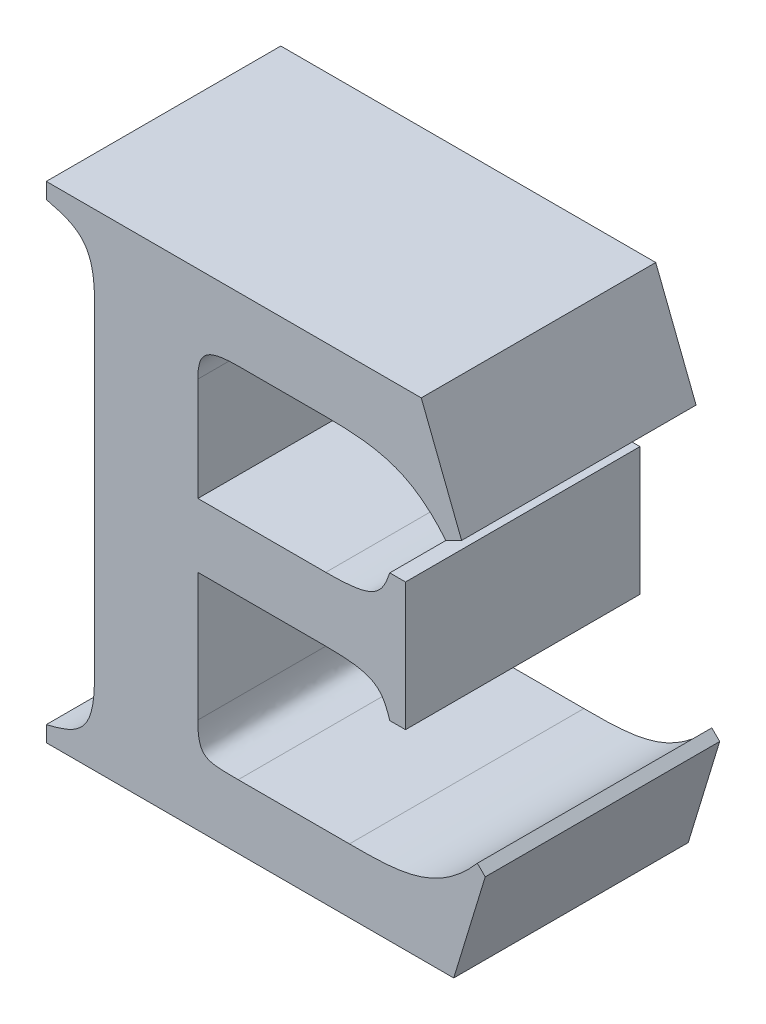
ISO-10303-21;
HEADER;
FILE_DESCRIPTION(('STEP AP214'),'2;1');
FILE_NAME('part.step','',(''),(''),'','','');
FILE_SCHEMA(('AUTOMOTIVE_DESIGN { 1 0 10303 214 1 1 1 1 }'));
ENDSEC;
DATA;
#1=APPLICATION_CONTEXT('core data for automotive mechanical design processes');
#2=APPLICATION_PROTOCOL_DEFINITION('international standard','automotive_design',2000,#1);
#3=PRODUCT_CONTEXT('',#1,'mechanical');
#4=PRODUCT('Part','Part','',(#3));
#5=PRODUCT_RELATED_PRODUCT_CATEGORY('part','',(#4));
#6=PRODUCT_DEFINITION_FORMATION('','',#4);
#7=PRODUCT_DEFINITION_CONTEXT('part definition',#1,'design');
#8=PRODUCT_DEFINITION('design','',#6,#7);
#9=PRODUCT_DEFINITION_SHAPE('','',#8);
#10=(LENGTH_UNIT() NAMED_UNIT(*) SI_UNIT(.MILLI.,.METRE.));
#11=(NAMED_UNIT(*) PLANE_ANGLE_UNIT() SI_UNIT($,.RADIAN.));
#12=(NAMED_UNIT(*) SI_UNIT($,.STERADIAN.) SOLID_ANGLE_UNIT());
#13=UNCERTAINTY_MEASURE_WITH_UNIT(LENGTH_MEASURE(1.E-05),#10,'distance_accuracy_value','');
#14=(GEOMETRIC_REPRESENTATION_CONTEXT(3) GLOBAL_UNCERTAINTY_ASSIGNED_CONTEXT((#13)) GLOBAL_UNIT_ASSIGNED_CONTEXT((#10,
#11,#12)) REPRESENTATION_CONTEXT('',''));
#15=CARTESIAN_POINT('',(0.,0.,0.));
#16=DIRECTION('',(0.,0.,1.));
#17=DIRECTION('',(1.,0.,0.));
#18=AXIS2_PLACEMENT_3D('',#15,#16,#17);
#19=CARTESIAN_POINT('',(0.951390842915,-0.14630890346375,0.));
#20=DIRECTION('',(0.,-1.,0.));
#21=DIRECTION('',(1.,0.,0.));
#22=AXIS2_PLACEMENT_3D('',#19,#20,#21);
#23=PLANE('',#22);
#24=DIRECTION('',(-1.,0.,0.));
#25=VECTOR('',#24,1.);
#26=CARTESIAN_POINT('',(1.125153850248,-0.14630890346375,0.));
#27=LINE('',#26,#25);
#28=CARTESIAN_POINT('',(1.125153850248,-0.14630890346375,0.));
#29=VERTEX_POINT('',#28);
#30=CARTESIAN_POINT('',(0.951390842915,-0.14630890346375,0.));
#31=VERTEX_POINT('',#30);
#32=EDGE_CURVE('E11',#29,#31,#27,.T.);
#33=ORIENTED_EDGE('',*,*,#32,.F.);
#34=DIRECTION('',(0.,0.,1.));
#35=VECTOR('',#34,1.);
#36=CARTESIAN_POINT('',(1.125153850248,-0.14630890346375,0.));
#37=LINE('',#36,#35);
#38=CARTESIAN_POINT('',(1.125153850248,-0.14630890346375,0.1));
#39=VERTEX_POINT('',#38);
#40=EDGE_CURVE('E24',#29,#39,#37,.T.);
#41=ORIENTED_EDGE('',*,*,#40,.T.);
#42=DIRECTION('',(1.,0.,0.));
#43=VECTOR('',#42,1.);
#44=CARTESIAN_POINT('',(1.125153850248,-0.14630890346375,0.1));
#45=LINE('',#44,#43);
#46=CARTESIAN_POINT('',(0.951390842915,-0.14630890346375,0.1));
#47=VERTEX_POINT('',#46);
#48=EDGE_CURVE('E208',#47,#39,#45,.T.);
#49=ORIENTED_EDGE('',*,*,#48,.F.);
#50=DIRECTION('',(0.,0.,1.));
#51=VECTOR('',#50,1.);
#52=CARTESIAN_POINT('',(0.951390842915,-0.14630890346375,0.));
#53=LINE('',#52,#51);
#54=EDGE_CURVE('E473',#31,#47,#53,.T.);
#55=ORIENTED_EDGE('',*,*,#54,.F.);
#56=EDGE_LOOP('',(#33,#41,#49,#55));
#57=FACE_BOUND('',#56,.T.);
#58=ADVANCED_FACE('F17',(#57),#23,.T.);
#59=CARTESIAN_POINT('',(0.951390842915,-0.13959341000028,0.));
#60=DIRECTION('',(-1.,0.,0.));
#61=DIRECTION('',(0.,-1.,0.));
#62=AXIS2_PLACEMENT_3D('',#59,#60,#61);
#63=PLANE('',#62);
#64=DIRECTION('',(0.,1.,0.));
#65=VECTOR('',#64,1.);
#66=CARTESIAN_POINT('',(0.951390842915,-0.14630890346375,0.));
#67=LINE('',#66,#65);
#68=CARTESIAN_POINT('',(0.951390842915,-0.13959341000028,0.));
#69=VERTEX_POINT('',#68);
#70=EDGE_CURVE('E471',#31,#69,#67,.T.);
#71=ORIENTED_EDGE('',*,*,#70,.F.);
#72=ORIENTED_EDGE('',*,*,#54,.T.);
#73=DIRECTION('',(0.,-1.,0.));
#74=VECTOR('',#73,1.);
#75=CARTESIAN_POINT('',(0.951390842915,-0.14630890346375,0.1));
#76=LINE('',#75,#74);
#77=CARTESIAN_POINT('',(0.951390842915,-0.13959341000028,0.1));
#78=VERTEX_POINT('',#77);
#79=EDGE_CURVE('E469',#78,#47,#76,.T.);
#80=ORIENTED_EDGE('',*,*,#79,.F.);
#81=DIRECTION('',(0.,0.,1.));
#82=VECTOR('',#81,1.);
#83=CARTESIAN_POINT('',(0.951390842915,-0.13959341000028,0.));
#84=LINE('',#83,#82);
#85=EDGE_CURVE('E463',#69,#78,#84,.T.);
#86=ORIENTED_EDGE('',*,*,#85,.F.);
#87=EDGE_LOOP('',(#71,#72,#80,#86));
#88=FACE_BOUND('',#87,.T.);
#89=ADVANCED_FACE('F567',(#88),#63,.T.);
#90=CARTESIAN_POINT('',(0.971956860328,-0.11231186792928,0.));
#91=CARTESIAN_POINT('',(0.971956860328,-0.11231186792928,0.1));
#92=CARTESIAN_POINT('',(0.971956860328,-0.13287791653682,0.));
#93=CARTESIAN_POINT('',(0.971956860328,-0.13287791653682,0.1));
#94=CARTESIAN_POINT('',(0.965241585227,-0.13623558528189,0.));
#95=CARTESIAN_POINT('',(0.965241585227,-0.13623558528189,0.1));
#96=CARTESIAN_POINT('',(0.951390842915,-0.13959341000028,0.));
#97=CARTESIAN_POINT('',(0.951390842915,-0.13959341000028,0.1));
#98=B_SPLINE_SURFACE_WITH_KNOTS('',3,1,((#90,#91),(#92,#93),(#94,#95),(#96,#97)),.UNSPECIFIED.,
.F.,.F.,.F.,(4,4),(2,2),(-1.,0.),(0.,0.01),.UNSPECIFIED.);
#99=CARTESIAN_POINT('',(0.951390842915,-0.13959341000028,0.));
#100=CARTESIAN_POINT('',(0.965241585227,-0.13623558528189,0.));
#101=CARTESIAN_POINT('',(0.971956860328,-0.13287791653682,0.));
#102=CARTESIAN_POINT('',(0.971956860328,-0.11231186792928,0.));
#103=B_SPLINE_CURVE_WITH_KNOTS('',3,(#99,#100,#101,#102),.UNSPECIFIED.,.F.,.F.,(4,4),(0.,1.),.UNSPECIFIED.);
#104=CARTESIAN_POINT('',(0.971956860328,-0.11231186792928,0.));
#105=VERTEX_POINT('',#104);
#106=EDGE_CURVE('E456',#69,#105,#103,.T.);
#107=CARTESIAN_POINT('',(0.971956860328,-0.11231186792928,0.1));
#108=CARTESIAN_POINT('',(0.971956860328,-0.13287791653682,0.1));
#109=CARTESIAN_POINT('',(0.965241585227,-0.13623558528189,0.1));
#110=CARTESIAN_POINT('',(0.951390842915,-0.13959341000028,0.1));
#111=B_SPLINE_CURVE_WITH_KNOTS('',3,(#107,#108,#109,#110),.UNSPECIFIED.,.F.,.F.,(4,4),(-1.,0.),.UNSPECIFIED.);
#112=CARTESIAN_POINT('',(0.971956860328,-0.11231186792928,0.1));
#113=VERTEX_POINT('',#112);
#114=EDGE_CURVE('E451',#113,#78,#111,.T.);
#115=DIRECTION('',(0.,0.,1.));
#116=VECTOR('',#115,1.);
#117=CARTESIAN_POINT('',(0.971956860328,-0.11231186792928,0.));
#118=LINE('',#117,#116);
#119=EDGE_CURVE('E448',#105,#113,#118,.T.);
#120=ORIENTED_EDGE('',*,*,#106,.F.);
#121=ORIENTED_EDGE('',*,*,#85,.T.);
#122=ORIENTED_EDGE('',*,*,#114,.F.);
#123=ORIENTED_EDGE('',*,*,#119,.F.);
#124=EDGE_LOOP('',(#120,#121,#122,#123));
#125=FACE_BOUND('',#124,.T.);
#126=ADVANCED_FACE('F563',(#125),#98,.T.);
#127=CARTESIAN_POINT('',(0.971956860328,0.027034067732,0.));
#128=DIRECTION('',(-1.,0.,0.));
#129=DIRECTION('',(0.,-1.,0.));
#130=AXIS2_PLACEMENT_3D('',#127,#128,#129);
#131=PLANE('',#130);
#132=DIRECTION('',(0.,1.,0.));
#133=VECTOR('',#132,1.);
#134=CARTESIAN_POINT('',(0.971956860328,-0.11231186792928,0.));
#135=LINE('',#134,#133);
#136=CARTESIAN_POINT('',(0.971956860328,0.027034067732,0.));
#137=VERTEX_POINT('',#136);
#138=EDGE_CURVE('E446',#105,#137,#135,.T.);
#139=ORIENTED_EDGE('',*,*,#138,.F.);
#140=ORIENTED_EDGE('',*,*,#119,.T.);
#141=DIRECTION('',(0.,-1.,0.));
#142=VECTOR('',#141,1.);
#143=CARTESIAN_POINT('',(0.971956860328,-0.11231186792928,0.1));
#144=LINE('',#143,#142);
#145=CARTESIAN_POINT('',(0.971956860328,0.027034067732,0.1));
#146=VERTEX_POINT('',#145);
#147=EDGE_CURVE('E443',#146,#113,#144,.T.);
#148=ORIENTED_EDGE('',*,*,#147,.F.);
#149=DIRECTION('',(0.,0.,1.));
#150=VECTOR('',#149,1.);
#151=CARTESIAN_POINT('',(0.971956860328,0.027034067732,0.));
#152=LINE('',#151,#150);
#153=EDGE_CURVE('E437',#137,#146,#152,.T.);
#154=ORIENTED_EDGE('',*,*,#153,.F.);
#155=EDGE_LOOP('',(#139,#140,#148,#154));
#156=FACE_BOUND('',#155,.T.);
#157=ADVANCED_FACE('F559',(#156),#131,.T.);
#158=CARTESIAN_POINT('',(0.951390842915,0.054315609803,0.));
#159=CARTESIAN_POINT('',(0.951390842915,0.054315609803,0.1));
#160=CARTESIAN_POINT('',(0.965241585227,0.050957941058,0.));
#161=CARTESIAN_POINT('',(0.965241585227,0.050957941058,0.1));
#162=CARTESIAN_POINT('',(0.971956860328,0.047600147535,0.));
#163=CARTESIAN_POINT('',(0.971956860328,0.047600147535,0.1));
#164=CARTESIAN_POINT('',(0.971956860328,0.027034067732,0.));
#165=CARTESIAN_POINT('',(0.971956860328,0.027034067732,0.1));
#166=B_SPLINE_SURFACE_WITH_KNOTS('',3,1,((#158,#159),(#160,#161),(#162,#163),(#164,#165)),
.UNSPECIFIED.,.F.,.F.,.F.,(4,4),(2,2),(-1.,0.),(0.,0.01),.UNSPECIFIED.);
#167=CARTESIAN_POINT('',(0.971956860328,0.027034067732,0.));
#168=CARTESIAN_POINT('',(0.971956860328,0.047600147535,0.));
#169=CARTESIAN_POINT('',(0.965241585227,0.050957941058,0.));
#170=CARTESIAN_POINT('',(0.951390842915,0.054315609803,0.));
#171=B_SPLINE_CURVE_WITH_KNOTS('',3,(#167,#168,#169,#170),.UNSPECIFIED.,.F.,.F.,(4,4),(0.,1.),.UNSPECIFIED.);
#172=CARTESIAN_POINT('',(0.951390842915,0.054315609803,0.));
#173=VERTEX_POINT('',#172);
#174=EDGE_CURVE('E430',#137,#173,#171,.T.);
#175=CARTESIAN_POINT('',(0.951390842915,0.054315609803,0.1));
#176=CARTESIAN_POINT('',(0.965241585227,0.050957941058,0.1));
#177=CARTESIAN_POINT('',(0.971956860328,0.047600147535,0.1));
#178=CARTESIAN_POINT('',(0.971956860328,0.027034067732,0.1));
#179=B_SPLINE_CURVE_WITH_KNOTS('',3,(#175,#176,#177,#178),.UNSPECIFIED.,.F.,.F.,(4,4),(-1.,0.),.UNSPECIFIED.);
#180=CARTESIAN_POINT('',(0.951390842915,0.054315609803,0.1));
#181=VERTEX_POINT('',#180);
#182=EDGE_CURVE('E425',#181,#146,#179,.T.);
#183=DIRECTION('',(0.,0.,1.));
#184=VECTOR('',#183,1.);
#185=CARTESIAN_POINT('',(0.951390842915,0.054315609803,0.));
#186=LINE('',#185,#184);
#187=EDGE_CURVE('E422',#173,#181,#186,.T.);
#188=ORIENTED_EDGE('',*,*,#174,.F.);
#189=ORIENTED_EDGE('',*,*,#153,.T.);
#190=ORIENTED_EDGE('',*,*,#182,.F.);
#191=ORIENTED_EDGE('',*,*,#187,.F.);
#192=EDGE_LOOP('',(#188,#189,#190,#191));
#193=FACE_BOUND('',#192,.T.);
#194=ADVANCED_FACE('F555',(#193),#166,.T.);
#195=CARTESIAN_POINT('',(0.951390842915,0.061031103267,0.));
#196=DIRECTION('',(-1.,0.,0.));
#197=DIRECTION('',(0.,-1.,0.));
#198=AXIS2_PLACEMENT_3D('',#195,#196,#197);
#199=PLANE('',#198);
#200=DIRECTION('',(0.,1.,0.));
#201=VECTOR('',#200,1.);
#202=CARTESIAN_POINT('',(0.951390842915,0.054315609803,0.));
#203=LINE('',#202,#201);
#204=CARTESIAN_POINT('',(0.951390842915,0.061031103267,0.));
#205=VERTEX_POINT('',#204);
#206=EDGE_CURVE('E420',#173,#205,#203,.T.);
#207=ORIENTED_EDGE('',*,*,#206,.F.);
#208=ORIENTED_EDGE('',*,*,#187,.T.);
#209=DIRECTION('',(0.,-1.,0.));
#210=VECTOR('',#209,1.);
#211=CARTESIAN_POINT('',(0.951390842915,0.054315609803,0.1));
#212=LINE('',#211,#210);
#213=CARTESIAN_POINT('',(0.951390842915,0.061031103267,0.1));
#214=VERTEX_POINT('',#213);
#215=EDGE_CURVE('E417',#214,#181,#212,.T.);
#216=ORIENTED_EDGE('',*,*,#215,.F.);
#217=DIRECTION('',(0.,0.,1.));
#218=VECTOR('',#217,1.);
#219=CARTESIAN_POINT('',(0.951390842915,0.061031103267,0.));
#220=LINE('',#219,#218);
#221=EDGE_CURVE('E414',#205,#214,#220,.T.);
#222=ORIENTED_EDGE('',*,*,#221,.F.);
#223=EDGE_LOOP('',(#207,#208,#216,#222));
#224=FACE_BOUND('',#223,.T.);
#225=ADVANCED_FACE('F551',(#224),#199,.T.);
#226=CARTESIAN_POINT('',(1.111302795989,0.061031103267,0.));
#227=DIRECTION('',(0.,1.,0.));
#228=DIRECTION('',(-1.,0.,0.));
#229=AXIS2_PLACEMENT_3D('',#226,#227,#228);
#230=PLANE('',#229);
#231=DIRECTION('',(1.,0.,0.));
#232=VECTOR('',#231,1.);
#233=CARTESIAN_POINT('',(0.951390842915,0.061031103267,0.));
#234=LINE('',#233,#232);
#235=CARTESIAN_POINT('',(1.111302795989,0.061031103267,0.));
#236=VERTEX_POINT('',#235);
#237=EDGE_CURVE('E412',#205,#236,#234,.T.);
#238=ORIENTED_EDGE('',*,*,#237,.F.);
#239=ORIENTED_EDGE('',*,*,#221,.T.);
#240=DIRECTION('',(-1.,0.,0.));
#241=VECTOR('',#240,1.);
#242=CARTESIAN_POINT('',(0.951390842915,0.061031103267,0.1));
#243=LINE('',#242,#241);
#244=CARTESIAN_POINT('',(1.111302795989,0.061031103267,0.1));
#245=VERTEX_POINT('',#244);
#246=EDGE_CURVE('E409',#245,#214,#243,.T.);
#247=ORIENTED_EDGE('',*,*,#246,.F.);
#248=DIRECTION('',(0.,0.,1.));
#249=VECTOR('',#248,1.);
#250=CARTESIAN_POINT('',(1.111302795989,0.061031103267,0.));
#251=LINE('',#250,#249);
#252=EDGE_CURVE('E406',#236,#245,#251,.T.);
#253=ORIENTED_EDGE('',*,*,#252,.F.);
#254=EDGE_LOOP('',(#238,#239,#247,#253));
#255=FACE_BOUND('',#254,.T.);
#256=ADVANCED_FACE('F547',(#255),#230,.T.);
#257=CARTESIAN_POINT('',(1.128510707932,0.016960905524,0.));
#258=DIRECTION('',(0.931507550185622,0.363721987164896,0.));
#259=DIRECTION('',(-0.363721987164896,0.931507550185622,0.));
#260=AXIS2_PLACEMENT_3D('',#257,#258,#259);
#261=PLANE('',#260);
#262=DIRECTION('',(0.363721987164896,-0.931507550185622,0.));
#263=VECTOR('',#262,1.);
#264=CARTESIAN_POINT('',(1.111302795989,0.061031103267,0.));
#265=LINE('',#264,#263);
#266=CARTESIAN_POINT('',(1.128510707932,0.016960905524,0.));
#267=VERTEX_POINT('',#266);
#268=EDGE_CURVE('E404',#236,#267,#265,.T.);
#269=ORIENTED_EDGE('',*,*,#268,.F.);
#270=ORIENTED_EDGE('',*,*,#252,.T.);
#271=DIRECTION('',(-0.363721987164896,0.931507550185622,0.));
#272=VECTOR('',#271,1.);
#273=CARTESIAN_POINT('',(1.111302795989,0.061031103267,0.1));
#274=LINE('',#273,#272);
#275=CARTESIAN_POINT('',(1.128510707932,0.016960905524,0.1));
#276=VERTEX_POINT('',#275);
#277=EDGE_CURVE('E401',#276,#245,#274,.T.);
#278=ORIENTED_EDGE('',*,*,#277,.F.);
#279=DIRECTION('',(0.,0.,1.));
#280=VECTOR('',#279,1.);
#281=CARTESIAN_POINT('',(1.128510707932,0.016960905524,0.));
#282=LINE('',#281,#280);
#283=EDGE_CURVE('E398',#267,#276,#282,.T.);
#284=ORIENTED_EDGE('',*,*,#283,.F.);
#285=EDGE_LOOP('',(#269,#270,#278,#284));
#286=FACE_BOUND('',#285,.T.);
#287=ADVANCED_FACE('F543',(#286),#261,.T.);
#288=CARTESIAN_POINT('',(1.121795432831,0.013603112,0.));
#289=DIRECTION('',(0.447230214922771,-0.894418881095503,0.));
#290=DIRECTION('',(0.894418881095503,0.447230214922771,0.));
#291=AXIS2_PLACEMENT_3D('',#288,#289,#290);
#292=PLANE('',#291);
#293=DIRECTION('',(-0.894418881095503,-0.447230214922771,0.));
#294=VECTOR('',#293,1.);
#295=CARTESIAN_POINT('',(1.128510707932,0.016960905524,0.));
#296=LINE('',#295,#294);
#297=CARTESIAN_POINT('',(1.121795432831,0.013603112,0.));
#298=VERTEX_POINT('',#297);
#299=EDGE_CURVE('E396',#267,#298,#296,.T.);
#300=ORIENTED_EDGE('',*,*,#299,.F.);
#301=ORIENTED_EDGE('',*,*,#283,.T.);
#302=DIRECTION('',(0.894418881095503,0.447230214922771,0.));
#303=VECTOR('',#302,1.);
#304=CARTESIAN_POINT('',(1.128510707932,0.016960905524,0.1));
#305=LINE('',#304,#303);
#306=CARTESIAN_POINT('',(1.121795432831,0.013603112,0.1));
#307=VERTEX_POINT('',#306);
#308=EDGE_CURVE('E393',#307,#276,#305,.T.);
#309=ORIENTED_EDGE('',*,*,#308,.F.);
#310=DIRECTION('',(0.,0.,1.));
#311=VECTOR('',#310,1.);
#312=CARTESIAN_POINT('',(1.121795432831,0.013603112,0.));
#313=LINE('',#312,#311);
#314=EDGE_CURVE('E387',#298,#307,#313,.T.);
#315=ORIENTED_EDGE('',*,*,#314,.F.);
#316=EDGE_LOOP('',(#300,#301,#309,#315));
#317=FACE_BOUND('',#316,.T.);
#318=ADVANCED_FACE('F539',(#317),#292,.T.);
#319=CARTESIAN_POINT('',(1.070590641327,0.033749561196,0.));
#320=CARTESIAN_POINT('',(1.070590641327,0.033749561196,0.1));
#321=CARTESIAN_POINT('',(1.094513828371,0.033749561196,0.));
#322=CARTESIAN_POINT('',(1.094513828371,0.033749561196,0.1));
#323=CARTESIAN_POINT('',(1.107944690519,0.0303917676719999,0.));
#324=CARTESIAN_POINT('',(1.107944690519,0.0303917676719999,0.1));
#325=CARTESIAN_POINT('',(1.121795432831,0.013603112,0.));
#326=CARTESIAN_POINT('',(1.121795432831,0.013603112,0.1));
#327=B_SPLINE_SURFACE_WITH_KNOTS('',3,1,((#319,#320),(#321,#322),(#323,#324),(#325,#326)),
.UNSPECIFIED.,.F.,.F.,.F.,(4,4),(2,2),(-1.,0.),(0.,0.01),.UNSPECIFIED.);
#328=CARTESIAN_POINT('',(1.121795432831,0.013603112,0.));
#329=CARTESIAN_POINT('',(1.107944690519,0.0303917676719999,0.));
#330=CARTESIAN_POINT('',(1.094513828371,0.033749561196,0.));
#331=CARTESIAN_POINT('',(1.070590641327,0.033749561196,0.));
#332=B_SPLINE_CURVE_WITH_KNOTS('',3,(#328,#329,#330,#331),.UNSPECIFIED.,.F.,.F.,(4,4),(0.,1.),.UNSPECIFIED.);
#333=CARTESIAN_POINT('',(1.070590641327,0.033749561196,0.));
#334=VERTEX_POINT('',#333);
#335=EDGE_CURVE('E380',#298,#334,#332,.T.);
#336=CARTESIAN_POINT('',(1.070590641327,0.033749561196,0.1));
#337=CARTESIAN_POINT('',(1.094513828371,0.033749561196,0.1));
#338=CARTESIAN_POINT('',(1.107944690519,0.0303917676719999,0.1));
#339=CARTESIAN_POINT('',(1.121795432831,0.013603112,0.1));
#340=B_SPLINE_CURVE_WITH_KNOTS('',3,(#336,#337,#338,#339),.UNSPECIFIED.,.F.,.F.,(4,4),(-1.,0.),.UNSPECIFIED.);
#341=CARTESIAN_POINT('',(1.070590641327,0.033749561196,0.1));
#342=VERTEX_POINT('',#341);
#343=EDGE_CURVE('E375',#342,#307,#340,.T.);
#344=DIRECTION('',(0.,0.,1.));
#345=VECTOR('',#344,1.);
#346=CARTESIAN_POINT('',(1.070590641327,0.033749561196,0.));
#347=LINE('',#346,#345);
#348=EDGE_CURVE('E372',#334,#342,#347,.T.);
#349=ORIENTED_EDGE('',*,*,#335,.F.);
#350=ORIENTED_EDGE('',*,*,#314,.T.);
#351=ORIENTED_EDGE('',*,*,#343,.F.);
#352=ORIENTED_EDGE('',*,*,#348,.F.);
#353=EDGE_LOOP('',(#349,#350,#351,#352));
#354=FACE_BOUND('',#353,.T.);
#355=ADVANCED_FACE('F535',(#354),#327,.T.);
#356=CARTESIAN_POINT('',(1.033235344349,0.033749561196,0.));
#357=DIRECTION('',(0.,-1.,0.));
#358=DIRECTION('',(1.,0.,0.));
#359=AXIS2_PLACEMENT_3D('',#356,#357,#358);
#360=PLANE('',#359);
#361=DIRECTION('',(-1.,0.,0.));
#362=VECTOR('',#361,1.);
#363=CARTESIAN_POINT('',(1.070590641327,0.033749561196,0.));
#364=LINE('',#363,#362);
#365=CARTESIAN_POINT('',(1.033235344349,0.033749561196,0.));
#366=VERTEX_POINT('',#365);
#367=EDGE_CURVE('E370',#334,#366,#364,.T.);
#368=ORIENTED_EDGE('',*,*,#367,.F.);
#369=ORIENTED_EDGE('',*,*,#348,.T.);
#370=DIRECTION('',(1.,0.,0.));
#371=VECTOR('',#370,1.);
#372=CARTESIAN_POINT('',(1.070590641327,0.033749561196,0.1));
#373=LINE('',#372,#371);
#374=CARTESIAN_POINT('',(1.033235344349,0.033749561196,0.1));
#375=VERTEX_POINT('',#374);
#376=EDGE_CURVE('E367',#375,#342,#373,.T.);
#377=ORIENTED_EDGE('',*,*,#376,.F.);
#378=DIRECTION('',(0.,0.,1.));
#379=VECTOR('',#378,1.);
#380=CARTESIAN_POINT('',(1.033235344349,0.033749561196,0.));
#381=LINE('',#380,#379);
#382=EDGE_CURVE('E361',#366,#375,#381,.T.);
#383=ORIENTED_EDGE('',*,*,#382,.F.);
#384=EDGE_LOOP('',(#368,#369,#377,#383));
#385=FACE_BOUND('',#384,.T.);
#386=ADVANCED_FACE('F531',(#385),#360,.T.);
#387=CARTESIAN_POINT('',(1.016027432407,0.020318574269,0.));
#388=CARTESIAN_POINT('',(1.016027432407,0.020318574269,0.1));
#389=CARTESIAN_POINT('',(1.016027432407,0.030391767672,0.));
#390=CARTESIAN_POINT('',(1.016027432407,0.030391767672,0.1));
#391=CARTESIAN_POINT('',(1.019384602037,0.033749561196,0.));
#392=CARTESIAN_POINT('',(1.019384602037,0.033749561196,0.1));
#393=CARTESIAN_POINT('',(1.033235344349,0.033749561196,0.));
#394=CARTESIAN_POINT('',(1.033235344349,0.033749561196,0.1));
#395=B_SPLINE_SURFACE_WITH_KNOTS('',3,1,((#387,#388),(#389,#390),(#391,#392),(#393,#394)),
.UNSPECIFIED.,.F.,.F.,.F.,(4,4),(2,2),(-1.,0.),(0.,0.01),.UNSPECIFIED.);
#396=CARTESIAN_POINT('',(1.033235344349,0.033749561196,0.));
#397=CARTESIAN_POINT('',(1.019384602037,0.033749561196,0.));
#398=CARTESIAN_POINT('',(1.016027432407,0.030391767672,0.));
#399=CARTESIAN_POINT('',(1.016027432407,0.020318574269,0.));
#400=B_SPLINE_CURVE_WITH_KNOTS('',3,(#396,#397,#398,#399),.UNSPECIFIED.,.F.,.F.,(4,4),(0.,1.),.UNSPECIFIED.);
#401=CARTESIAN_POINT('',(1.016027432407,0.020318574269,0.));
#402=VERTEX_POINT('',#401);
#403=EDGE_CURVE('E354',#366,#402,#400,.T.);
#404=CARTESIAN_POINT('',(1.016027432407,0.020318574269,0.1));
#405=CARTESIAN_POINT('',(1.016027432407,0.030391767672,0.1));
#406=CARTESIAN_POINT('',(1.019384602037,0.033749561196,0.1));
#407=CARTESIAN_POINT('',(1.033235344349,0.033749561196,0.1));
#408=B_SPLINE_CURVE_WITH_KNOTS('',3,(#404,#405,#406,#407),.UNSPECIFIED.,.F.,.F.,(4,4),(-1.,0.),.UNSPECIFIED.);
#409=CARTESIAN_POINT('',(1.016027432407,0.020318574269,0.1));
#410=VERTEX_POINT('',#409);
#411=EDGE_CURVE('E349',#410,#375,#408,.T.);
#412=DIRECTION('',(0.,0.,1.));
#413=VECTOR('',#412,1.);
#414=CARTESIAN_POINT('',(1.016027432407,0.020318574269,0.));
#415=LINE('',#414,#413);
#416=EDGE_CURVE('E346',#402,#410,#415,.T.);
#417=ORIENTED_EDGE('',*,*,#403,.F.);
#418=ORIENTED_EDGE('',*,*,#382,.T.);
#419=ORIENTED_EDGE('',*,*,#411,.F.);
#420=ORIENTED_EDGE('',*,*,#416,.F.);
#421=EDGE_LOOP('',(#417,#418,#419,#420));
#422=FACE_BOUND('',#421,.T.);
#423=ADVANCED_FACE('F527',(#422),#395,.T.);
#424=CARTESIAN_POINT('',(1.016027432407,-0.023751623474,0.));
#425=DIRECTION('',(1.,0.,0.));
#426=DIRECTION('',(0.,1.,0.));
#427=AXIS2_PLACEMENT_3D('',#424,#425,#426);
#428=PLANE('',#427);
#429=DIRECTION('',(0.,-1.,0.));
#430=VECTOR('',#429,1.);
#431=CARTESIAN_POINT('',(1.016027432407,0.020318574269,0.));
#432=LINE('',#431,#430);
#433=CARTESIAN_POINT('',(1.016027432407,-0.023751623474,0.));
#434=VERTEX_POINT('',#433);
#435=EDGE_CURVE('E344',#402,#434,#432,.T.);
#436=ORIENTED_EDGE('',*,*,#435,.F.);
#437=ORIENTED_EDGE('',*,*,#416,.T.);
#438=DIRECTION('',(0.,1.,0.));
#439=VECTOR('',#438,1.);
#440=CARTESIAN_POINT('',(1.016027432407,0.020318574269,0.1));
#441=LINE('',#440,#439);
#442=CARTESIAN_POINT('',(1.016027432407,-0.023751623474,0.1));
#443=VERTEX_POINT('',#442);
#444=EDGE_CURVE('E341',#443,#410,#441,.T.);
#445=ORIENTED_EDGE('',*,*,#444,.F.);
#446=DIRECTION('',(0.,0.,1.));
#447=VECTOR('',#446,1.);
#448=CARTESIAN_POINT('',(1.016027432407,-0.023751623474,0.));
#449=LINE('',#448,#447);
#450=EDGE_CURVE('E338',#434,#443,#449,.T.);
#451=ORIENTED_EDGE('',*,*,#450,.F.);
#452=EDGE_LOOP('',(#436,#437,#445,#451));
#453=FACE_BOUND('',#452,.T.);
#454=ADVANCED_FACE('F523',(#453),#428,.T.);
#455=CARTESIAN_POINT('',(1.070590641327,-0.023751623474,0.));
#456=DIRECTION('',(0.,1.,0.));
#457=DIRECTION('',(-1.,0.,0.));
#458=AXIS2_PLACEMENT_3D('',#455,#456,#457);
#459=PLANE('',#458);
#460=DIRECTION('',(1.,0.,0.));
#461=VECTOR('',#460,1.);
#462=CARTESIAN_POINT('',(1.016027432407,-0.023751623474,0.));
#463=LINE('',#462,#461);
#464=CARTESIAN_POINT('',(1.070590641327,-0.023751623474,0.));
#465=VERTEX_POINT('',#464);
#466=EDGE_CURVE('E336',#434,#465,#463,.T.);
#467=ORIENTED_EDGE('',*,*,#466,.F.);
#468=ORIENTED_EDGE('',*,*,#450,.T.);
#469=DIRECTION('',(-1.,0.,0.));
#470=VECTOR('',#469,1.);
#471=CARTESIAN_POINT('',(1.016027432407,-0.023751623474,0.1));
#472=LINE('',#471,#470);
#473=CARTESIAN_POINT('',(1.070590641327,-0.023751623474,0.1));
#474=VERTEX_POINT('',#473);
#475=EDGE_CURVE('E333',#474,#443,#472,.T.);
#476=ORIENTED_EDGE('',*,*,#475,.F.);
#477=DIRECTION('',(0.,0.,1.));
#478=VECTOR('',#477,1.);
#479=CARTESIAN_POINT('',(1.070590641327,-0.023751623474,0.));
#480=LINE('',#479,#478);
#481=EDGE_CURVE('E327',#465,#474,#480,.T.);
#482=ORIENTED_EDGE('',*,*,#481,.F.);
#483=EDGE_LOOP('',(#467,#468,#476,#482));
#484=FACE_BOUND('',#483,.T.);
#485=ADVANCED_FACE('F519',(#484),#459,.T.);
#486=CARTESIAN_POINT('',(1.097872245788,-0.010320636547,0.));
#487=CARTESIAN_POINT('',(1.097872245788,-0.010320636547,0.1));
#488=CARTESIAN_POINT('',(1.094513828371,-0.0203939235340003,0.));
#489=CARTESIAN_POINT('',(1.094513828371,-0.0203939235340003,0.1));
#490=CARTESIAN_POINT('',(1.091156970687,-0.0237516234740003,0.));
#491=CARTESIAN_POINT('',(1.091156970687,-0.0237516234740003,0.1));
#492=CARTESIAN_POINT('',(1.070590641327,-0.023751623474,0.));
#493=CARTESIAN_POINT('',(1.070590641327,-0.023751623474,0.1));
#494=B_SPLINE_SURFACE_WITH_KNOTS('',3,1,((#486,#487),(#488,#489),(#490,#491),(#492,#493)),
.UNSPECIFIED.,.F.,.F.,.F.,(4,4),(2,2),(-1.,0.),(0.,0.01),.UNSPECIFIED.);
#495=CARTESIAN_POINT('',(1.070590641327,-0.023751623474,0.));
#496=CARTESIAN_POINT('',(1.091156970687,-0.0237516234740003,0.));
#497=CARTESIAN_POINT('',(1.094513828371,-0.0203939235340003,0.));
#498=CARTESIAN_POINT('',(1.097872245788,-0.010320636547,0.));
#499=B_SPLINE_CURVE_WITH_KNOTS('',3,(#495,#496,#497,#498),.UNSPECIFIED.,.F.,.F.,(4,4),(0.,1.),.UNSPECIFIED.);
#500=CARTESIAN_POINT('',(1.097872245788,-0.010320636547,0.));
#501=VERTEX_POINT('',#500);
#502=EDGE_CURVE('E320',#465,#501,#499,.T.);
#503=CARTESIAN_POINT('',(1.097872245788,-0.010320636547,0.1));
#504=CARTESIAN_POINT('',(1.094513828371,-0.0203939235340003,0.1));
#505=CARTESIAN_POINT('',(1.091156970687,-0.0237516234740003,0.1));
#506=CARTESIAN_POINT('',(1.070590641327,-0.023751623474,0.1));
#507=B_SPLINE_CURVE_WITH_KNOTS('',3,(#503,#504,#505,#506),.UNSPECIFIED.,.F.,.F.,(4,4),(-1.,0.),.UNSPECIFIED.);
#508=CARTESIAN_POINT('',(1.097872245788,-0.010320636547,0.1));
#509=VERTEX_POINT('',#508);
#510=EDGE_CURVE('E315',#509,#474,#507,.T.);
#511=DIRECTION('',(0.,0.,1.));
#512=VECTOR('',#511,1.);
#513=CARTESIAN_POINT('',(1.097872245788,-0.010320636547,0.));
#514=LINE('',#513,#512);
#515=EDGE_CURVE('E312',#501,#509,#514,.T.);
#516=ORIENTED_EDGE('',*,*,#502,.F.);
#517=ORIENTED_EDGE('',*,*,#481,.T.);
#518=ORIENTED_EDGE('',*,*,#510,.F.);
#519=ORIENTED_EDGE('',*,*,#515,.F.);
#520=EDGE_LOOP('',(#516,#517,#518,#519));
#521=FACE_BOUND('',#520,.T.);
#522=ADVANCED_FACE('F515',(#521),#494,.T.);
#523=CARTESIAN_POINT('',(1.104587520889,-0.010320636547,0.));
#524=DIRECTION('',(0.,1.,0.));
#525=DIRECTION('',(-1.,0.,0.));
#526=AXIS2_PLACEMENT_3D('',#523,#524,#525);
#527=PLANE('',#526);
#528=DIRECTION('',(1.,0.,0.));
#529=VECTOR('',#528,1.);
#530=CARTESIAN_POINT('',(1.097872245788,-0.010320636547,0.));
#531=LINE('',#530,#529);
#532=CARTESIAN_POINT('',(1.104587520889,-0.010320636547,0.));
#533=VERTEX_POINT('',#532);
#534=EDGE_CURVE('E310',#501,#533,#531,.T.);
#535=ORIENTED_EDGE('',*,*,#534,.F.);
#536=ORIENTED_EDGE('',*,*,#515,.T.);
#537=DIRECTION('',(-1.,0.,0.));
#538=VECTOR('',#537,1.);
#539=CARTESIAN_POINT('',(1.097872245788,-0.010320636547,0.1));
#540=LINE('',#539,#538);
#541=CARTESIAN_POINT('',(1.104587520889,-0.010320636547,0.1));
#542=VERTEX_POINT('',#541);
#543=EDGE_CURVE('E307',#542,#509,#540,.T.);
#544=ORIENTED_EDGE('',*,*,#543,.F.);
#545=DIRECTION('',(0.,0.,1.));
#546=VECTOR('',#545,1.);
#547=CARTESIAN_POINT('',(1.104587520889,-0.010320636547,0.));
#548=LINE('',#547,#546);
#549=EDGE_CURVE('E304',#533,#542,#548,.T.);
#550=ORIENTED_EDGE('',*,*,#549,.F.);
#551=EDGE_LOOP('',(#535,#536,#544,#550));
#552=FACE_BOUND('',#551,.T.);
#553=ADVANCED_FACE('F511',(#552),#527,.T.);
#554=CARTESIAN_POINT('',(1.104587520889,-0.064883845468,0.));
#555=DIRECTION('',(1.,0.,0.));
#556=DIRECTION('',(0.,1.,0.));
#557=AXIS2_PLACEMENT_3D('',#554,#555,#556);
#558=PLANE('',#557);
#559=DIRECTION('',(0.,-1.,0.));
#560=VECTOR('',#559,1.);
#561=CARTESIAN_POINT('',(1.104587520889,-0.010320636547,0.));
#562=LINE('',#561,#560);
#563=CARTESIAN_POINT('',(1.104587520889,-0.064883845468,0.));
#564=VERTEX_POINT('',#563);
#565=EDGE_CURVE('E302',#533,#564,#562,.T.);
#566=ORIENTED_EDGE('',*,*,#565,.F.);
#567=ORIENTED_EDGE('',*,*,#549,.T.);
#568=DIRECTION('',(0.,1.,0.));
#569=VECTOR('',#568,1.);
#570=CARTESIAN_POINT('',(1.104587520889,-0.010320636547,0.1));
#571=LINE('',#570,#569);
#572=CARTESIAN_POINT('',(1.104587520889,-0.064883845468,0.1));
#573=VERTEX_POINT('',#572);
#574=EDGE_CURVE('E299',#573,#542,#571,.T.);
#575=ORIENTED_EDGE('',*,*,#574,.F.);
#576=DIRECTION('',(0.,0.,1.));
#577=VECTOR('',#576,1.);
#578=CARTESIAN_POINT('',(1.104587520889,-0.064883845468,0.));
#579=LINE('',#578,#577);
#580=EDGE_CURVE('E296',#564,#573,#579,.T.);
#581=ORIENTED_EDGE('',*,*,#580,.F.);
#582=EDGE_LOOP('',(#566,#567,#575,#581));
#583=FACE_BOUND('',#582,.T.);
#584=ADVANCED_FACE('F507',(#583),#558,.T.);
#585=CARTESIAN_POINT('',(1.097872245788,-0.064883845468,0.));
#586=DIRECTION('',(0.,-1.,0.));
#587=DIRECTION('',(1.,0.,0.));
#588=AXIS2_PLACEMENT_3D('',#585,#586,#587);
#589=PLANE('',#588);
#590=DIRECTION('',(-1.,0.,0.));
#591=VECTOR('',#590,1.);
#592=CARTESIAN_POINT('',(1.104587520889,-0.064883845468,0.));
#593=LINE('',#592,#591);
#594=CARTESIAN_POINT('',(1.097872245788,-0.064883845468,0.));
#595=VERTEX_POINT('',#594);
#596=EDGE_CURVE('E294',#564,#595,#593,.T.);
#597=ORIENTED_EDGE('',*,*,#596,.F.);
#598=ORIENTED_EDGE('',*,*,#580,.T.);
#599=DIRECTION('',(1.,0.,0.));
#600=VECTOR('',#599,1.);
#601=CARTESIAN_POINT('',(1.104587520889,-0.064883845468,0.1));
#602=LINE('',#601,#600);
#603=CARTESIAN_POINT('',(1.097872245788,-0.064883845468,0.1));
#604=VERTEX_POINT('',#603);
#605=EDGE_CURVE('E291',#604,#573,#602,.T.);
#606=ORIENTED_EDGE('',*,*,#605,.F.);
#607=DIRECTION('',(0.,0.,1.));
#608=VECTOR('',#607,1.);
#609=CARTESIAN_POINT('',(1.097872245788,-0.064883845468,0.));
#610=LINE('',#609,#608);
#611=EDGE_CURVE('E285',#595,#604,#610,.T.);
#612=ORIENTED_EDGE('',*,*,#611,.F.);
#613=EDGE_LOOP('',(#597,#598,#606,#612));
#614=FACE_BOUND('',#613,.T.);
#615=ADVANCED_FACE('F503',(#614),#589,.T.);
#616=CARTESIAN_POINT('',(1.070590641327,-0.051033165545,0.));
#617=CARTESIAN_POINT('',(1.070590641327,-0.051033165545,0.1));
#618=CARTESIAN_POINT('',(1.091156970687,-0.051033165545,0.));
#619=CARTESIAN_POINT('',(1.091156970687,-0.051033165545,0.1));
#620=CARTESIAN_POINT('',(1.094513828371,-0.0543909590690003,0.));
#621=CARTESIAN_POINT('',(1.094513828371,-0.0543909590690003,0.1));
#622=CARTESIAN_POINT('',(1.097872245788,-0.064883845468,0.));
#623=CARTESIAN_POINT('',(1.097872245788,-0.064883845468,0.1));
#624=B_SPLINE_SURFACE_WITH_KNOTS('',3,1,((#616,#617),(#618,#619),(#620,#621),(#622,#623)),
.UNSPECIFIED.,.F.,.F.,.F.,(4,4),(2,2),(-1.,0.),(0.,0.01),.UNSPECIFIED.);
#625=CARTESIAN_POINT('',(1.097872245788,-0.064883845468,0.));
#626=CARTESIAN_POINT('',(1.094513828371,-0.0543909590690003,0.));
#627=CARTESIAN_POINT('',(1.091156970687,-0.051033165545,0.));
#628=CARTESIAN_POINT('',(1.070590641327,-0.051033165545,0.));
#629=B_SPLINE_CURVE_WITH_KNOTS('',3,(#625,#626,#627,#628),.UNSPECIFIED.,.F.,.F.,(4,4),(0.,1.),.UNSPECIFIED.);
#630=CARTESIAN_POINT('',(1.070590641327,-0.051033165545,0.));
#631=VERTEX_POINT('',#630);
#632=EDGE_CURVE('E278',#595,#631,#629,.T.);
#633=CARTESIAN_POINT('',(1.070590641327,-0.051033165545,0.1));
#634=CARTESIAN_POINT('',(1.091156970687,-0.051033165545,0.1));
#635=CARTESIAN_POINT('',(1.094513828371,-0.0543909590690003,0.1));
#636=CARTESIAN_POINT('',(1.097872245788,-0.064883845468,0.1));
#637=B_SPLINE_CURVE_WITH_KNOTS('',3,(#633,#634,#635,#636),.UNSPECIFIED.,.F.,.F.,(4,4),(-1.,0.),.UNSPECIFIED.);
#638=CARTESIAN_POINT('',(1.070590641327,-0.051033165545,0.1));
#639=VERTEX_POINT('',#638);
#640=EDGE_CURVE('E273',#639,#604,#637,.T.);
#641=DIRECTION('',(0.,0.,1.));
#642=VECTOR('',#641,1.);
#643=CARTESIAN_POINT('',(1.070590641327,-0.051033165545,0.));
#644=LINE('',#643,#642);
#645=EDGE_CURVE('E270',#631,#639,#644,.T.);
#646=ORIENTED_EDGE('',*,*,#632,.F.);
#647=ORIENTED_EDGE('',*,*,#611,.T.);
#648=ORIENTED_EDGE('',*,*,#640,.F.);
#649=ORIENTED_EDGE('',*,*,#645,.F.);
#650=EDGE_LOOP('',(#646,#647,#648,#649));
#651=FACE_BOUND('',#650,.T.);
#652=ADVANCED_FACE('F499',(#651),#624,.T.);
#653=CARTESIAN_POINT('',(1.016027432407,-0.051033165545,0.));
#654=DIRECTION('',(0.,-1.,0.));
#655=DIRECTION('',(1.,0.,0.));
#656=AXIS2_PLACEMENT_3D('',#653,#654,#655);
#657=PLANE('',#656);
#658=DIRECTION('',(-1.,0.,0.));
#659=VECTOR('',#658,1.);
#660=CARTESIAN_POINT('',(1.070590641327,-0.051033165545,0.));
#661=LINE('',#660,#659);
#662=CARTESIAN_POINT('',(1.016027432407,-0.051033165545,0.));
#663=VERTEX_POINT('',#662);
#664=EDGE_CURVE('E268',#631,#663,#661,.T.);
#665=ORIENTED_EDGE('',*,*,#664,.F.);
#666=ORIENTED_EDGE('',*,*,#645,.T.);
#667=DIRECTION('',(1.,0.,0.));
#668=VECTOR('',#667,1.);
#669=CARTESIAN_POINT('',(1.070590641327,-0.051033165545,0.1));
#670=LINE('',#669,#668);
#671=CARTESIAN_POINT('',(1.016027432407,-0.051033165545,0.1));
#672=VERTEX_POINT('',#671);
#673=EDGE_CURVE('E265',#672,#639,#670,.T.);
#674=ORIENTED_EDGE('',*,*,#673,.F.);
#675=DIRECTION('',(0.,0.,1.));
#676=VECTOR('',#675,1.);
#677=CARTESIAN_POINT('',(1.016027432407,-0.051033165545,0.));
#678=LINE('',#677,#676);
#679=EDGE_CURVE('E262',#663,#672,#678,.T.);
#680=ORIENTED_EDGE('',*,*,#679,.F.);
#681=EDGE_LOOP('',(#665,#666,#674,#680));
#682=FACE_BOUND('',#681,.T.);
#683=ADVANCED_FACE('F495',(#682),#657,.T.);
#684=CARTESIAN_POINT('',(1.016027432407,-0.10559637446581,0.));
#685=DIRECTION('',(1.,0.,0.));
#686=DIRECTION('',(0.,1.,0.));
#687=AXIS2_PLACEMENT_3D('',#684,#685,#686);
#688=PLANE('',#687);
#689=DIRECTION('',(0.,-1.,0.));
#690=VECTOR('',#689,1.);
#691=CARTESIAN_POINT('',(1.016027432407,-0.051033165545,0.));
#692=LINE('',#691,#690);
#693=CARTESIAN_POINT('',(1.016027432407,-0.10559637446581,0.));
#694=VERTEX_POINT('',#693);
#695=EDGE_CURVE('E260',#663,#694,#692,.T.);
#696=ORIENTED_EDGE('',*,*,#695,.F.);
#697=ORIENTED_EDGE('',*,*,#679,.T.);
#698=DIRECTION('',(0.,1.,0.));
#699=VECTOR('',#698,1.);
#700=CARTESIAN_POINT('',(1.016027432407,-0.051033165545,0.1));
#701=LINE('',#700,#699);
#702=CARTESIAN_POINT('',(1.016027432407,-0.10559637446581,0.1));
#703=VERTEX_POINT('',#702);
#704=EDGE_CURVE('E257',#703,#672,#701,.T.);
#705=ORIENTED_EDGE('',*,*,#704,.F.);
#706=DIRECTION('',(0.,0.,1.));
#707=VECTOR('',#706,1.);
#708=CARTESIAN_POINT('',(1.016027432407,-0.10559637446581,0.));
#709=LINE('',#708,#707);
#710=EDGE_CURVE('E251',#694,#703,#709,.T.);
#711=ORIENTED_EDGE('',*,*,#710,.F.);
#712=EDGE_LOOP('',(#696,#697,#705,#711));
#713=FACE_BOUND('',#712,.T.);
#714=ADVANCED_FACE('F491',(#713),#688,.T.);
#715=CARTESIAN_POINT('',(1.033235344349,-0.11902723661408,0.));
#716=CARTESIAN_POINT('',(1.033235344349,-0.11902723661408,0.1));
#717=CARTESIAN_POINT('',(1.019384602037,-0.11902723661408,0.));
#718=CARTESIAN_POINT('',(1.019384602037,-0.11902723661408,0.1));
#719=CARTESIAN_POINT('',(1.016027432407,-0.11902723661408,0.));
#720=CARTESIAN_POINT('',(1.016027432407,-0.11902723661408,0.1));
#721=CARTESIAN_POINT('',(1.016027432407,-0.10559637446581,0.));
#722=CARTESIAN_POINT('',(1.016027432407,-0.10559637446581,0.1));
#723=B_SPLINE_SURFACE_WITH_KNOTS('',3,1,((#715,#716),(#717,#718),(#719,#720),(#721,#722)),
.UNSPECIFIED.,.F.,.F.,.F.,(4,4),(2,2),(-1.,0.),(0.,0.01),.UNSPECIFIED.);
#724=CARTESIAN_POINT('',(1.016027432407,-0.10559637446581,0.));
#725=CARTESIAN_POINT('',(1.016027432407,-0.11902723661408,0.));
#726=CARTESIAN_POINT('',(1.019384602037,-0.11902723661408,0.));
#727=CARTESIAN_POINT('',(1.033235344349,-0.11902723661408,0.));
#728=B_SPLINE_CURVE_WITH_KNOTS('',3,(#724,#725,#726,#727),.UNSPECIFIED.,.F.,.F.,(4,4),(0.,1.),.UNSPECIFIED.);
#729=CARTESIAN_POINT('',(1.033235344349,-0.11902723661408,0.));
#730=VERTEX_POINT('',#729);
#731=EDGE_CURVE('E244',#694,#730,#728,.T.);
#732=CARTESIAN_POINT('',(1.033235344349,-0.11902723661408,0.1));
#733=CARTESIAN_POINT('',(1.019384602037,-0.11902723661408,0.1));
#734=CARTESIAN_POINT('',(1.016027432407,-0.11902723661408,0.1));
#735=CARTESIAN_POINT('',(1.016027432407,-0.10559637446581,0.1));
#736=B_SPLINE_CURVE_WITH_KNOTS('',3,(#732,#733,#734,#735),.UNSPECIFIED.,.F.,.F.,(4,4),(-1.,0.),.UNSPECIFIED.);
#737=CARTESIAN_POINT('',(1.033235344349,-0.11902723661408,0.1));
#738=VERTEX_POINT('',#737);
#739=EDGE_CURVE('E239',#738,#703,#736,.T.);
#740=DIRECTION('',(0.,0.,1.));
#741=VECTOR('',#740,1.);
#742=CARTESIAN_POINT('',(1.033235344349,-0.11902723661408,0.));
#743=LINE('',#742,#741);
#744=EDGE_CURVE('E236',#730,#738,#743,.T.);
#745=ORIENTED_EDGE('',*,*,#731,.F.);
#746=ORIENTED_EDGE('',*,*,#710,.T.);
#747=ORIENTED_EDGE('',*,*,#739,.F.);
#748=ORIENTED_EDGE('',*,*,#744,.F.);
#749=EDGE_LOOP('',(#745,#746,#747,#748));
#750=FACE_BOUND('',#749,.T.);
#751=ADVANCED_FACE('F487',(#750),#723,.T.);
#752=CARTESIAN_POINT('',(1.080663086059,-0.11902723661408,0.));
#753=DIRECTION('',(0.,1.,0.));
#754=DIRECTION('',(-1.,0.,0.));
#755=AXIS2_PLACEMENT_3D('',#752,#753,#754);
#756=PLANE('',#755);
#757=DIRECTION('',(1.,0.,0.));
#758=VECTOR('',#757,1.);
#759=CARTESIAN_POINT('',(1.033235344349,-0.11902723661408,0.));
#760=LINE('',#759,#758);
#761=CARTESIAN_POINT('',(1.080663086059,-0.11902723661408,0.));
#762=VERTEX_POINT('',#761);
#763=EDGE_CURVE('E234',#730,#762,#760,.T.);
#764=ORIENTED_EDGE('',*,*,#763,.F.);
#765=ORIENTED_EDGE('',*,*,#744,.T.);
#766=DIRECTION('',(-1.,0.,0.));
#767=VECTOR('',#766,1.);
#768=CARTESIAN_POINT('',(1.033235344349,-0.11902723661408,0.1));
#769=LINE('',#768,#767);
#770=CARTESIAN_POINT('',(1.080663086059,-0.11902723661408,0.1));
#771=VERTEX_POINT('',#770);
#772=EDGE_CURVE('E231',#771,#738,#769,.T.);
#773=ORIENTED_EDGE('',*,*,#772,.F.);
#774=DIRECTION('',(0.,0.,1.));
#775=VECTOR('',#774,1.);
#776=CARTESIAN_POINT('',(1.080663086059,-0.11902723661408,0.));
#777=LINE('',#776,#775);
#778=EDGE_CURVE('E225',#762,#771,#777,.T.);
#779=ORIENTED_EDGE('',*,*,#778,.F.);
#780=EDGE_LOOP('',(#764,#765,#773,#779));
#781=FACE_BOUND('',#780,.T.);
#782=ADVANCED_FACE('F483',(#781),#756,.T.);
#783=CARTESIAN_POINT('',(1.135226294979,-0.09888088100234,0.));
#784=CARTESIAN_POINT('',(1.135226294979,-0.09888088100234,0.1));
#785=CARTESIAN_POINT('',(1.118018383037,-0.11902723661408,0.));
#786=CARTESIAN_POINT('',(1.118018383037,-0.11902723661408,0.1));
#787=CARTESIAN_POINT('',(1.101229103472,-0.11902723661408,0.));
#788=CARTESIAN_POINT('',(1.101229103472,-0.11902723661408,0.1));
#789=CARTESIAN_POINT('',(1.080663086059,-0.11902723661408,0.));
#790=CARTESIAN_POINT('',(1.080663086059,-0.11902723661408,0.1));
#791=B_SPLINE_SURFACE_WITH_KNOTS('',3,1,((#783,#784),(#785,#786),(#787,#788),(#789,#790)),
.UNSPECIFIED.,.F.,.F.,.F.,(4,4),(2,2),(-1.,0.),(0.,0.01),.UNSPECIFIED.);
#792=CARTESIAN_POINT('',(1.080663086059,-0.11902723661408,0.));
#793=CARTESIAN_POINT('',(1.101229103472,-0.11902723661408,0.));
#794=CARTESIAN_POINT('',(1.118018383037,-0.11902723661408,0.));
#795=CARTESIAN_POINT('',(1.135226294979,-0.09888088100234,0.));
#796=B_SPLINE_CURVE_WITH_KNOTS('',3,(#792,#793,#794,#795),.UNSPECIFIED.,.F.,.F.,(4,4),(0.,1.),.UNSPECIFIED.);
#797=CARTESIAN_POINT('',(1.135226294979,-0.09888088100234,0.));
#798=VERTEX_POINT('',#797);
#799=EDGE_CURVE('E218',#762,#798,#796,.T.);
#800=CARTESIAN_POINT('',(1.135226294979,-0.09888088100234,0.1));
#801=CARTESIAN_POINT('',(1.118018383037,-0.11902723661408,0.1));
#802=CARTESIAN_POINT('',(1.101229103472,-0.11902723661408,0.1));
#803=CARTESIAN_POINT('',(1.080663086059,-0.11902723661408,0.1));
#804=B_SPLINE_CURVE_WITH_KNOTS('',3,(#800,#801,#802,#803),.UNSPECIFIED.,.F.,.F.,(4,4),(-1.,0.),.UNSPECIFIED.);
#805=CARTESIAN_POINT('',(1.135226294979,-0.09888088100234,0.1));
#806=VERTEX_POINT('',#805);
#807=EDGE_CURVE('E214',#806,#771,#804,.T.);
#808=DIRECTION('',(0.,0.,1.));
#809=VECTOR('',#808,1.);
#810=CARTESIAN_POINT('',(1.135226294979,-0.09888088100234,0.));
#811=LINE('',#810,#809);
#812=EDGE_CURVE('E193',#798,#806,#811,.T.);
#813=ORIENTED_EDGE('',*,*,#799,.F.);
#814=ORIENTED_EDGE('',*,*,#778,.T.);
#815=ORIENTED_EDGE('',*,*,#807,.F.);
#816=ORIENTED_EDGE('',*,*,#812,.F.);
#817=EDGE_LOOP('',(#813,#814,#815,#816));
#818=FACE_BOUND('',#817,.T.);
#819=ADVANCED_FACE('F481',(#818),#791,.T.);
#820=CARTESIAN_POINT('',(1.13858440045,-0.10223858094208,0.));
#821=DIRECTION('',(0.707064081533475,0.707149478261296,0.));
#822=DIRECTION('',(-0.707149478261296,0.707064081533475,0.));
#823=AXIS2_PLACEMENT_3D('',#820,#821,#822);
#824=PLANE('',#823);
#825=DIRECTION('',(0.707149478261296,-0.707064081533475,0.));
#826=VECTOR('',#825,1.);
#827=CARTESIAN_POINT('',(1.135226294979,-0.09888088100234,0.));
#828=LINE('',#827,#826);
#829=CARTESIAN_POINT('',(1.13858440045,-0.10223858094208,0.));
#830=VERTEX_POINT('',#829);
#831=EDGE_CURVE('E197',#798,#830,#828,.T.);
#832=ORIENTED_EDGE('',*,*,#831,.F.);
#833=ORIENTED_EDGE('',*,*,#812,.T.);
#834=DIRECTION('',(-0.707149478261296,0.707064081533475,0.));
#835=VECTOR('',#834,1.);
#836=CARTESIAN_POINT('',(1.135226294979,-0.09888088100234,0.1));
#837=LINE('',#836,#835);
#838=CARTESIAN_POINT('',(1.13858440045,-0.10223858094208,0.1));
#839=VERTEX_POINT('',#838);
#840=EDGE_CURVE('E186',#839,#806,#837,.T.);
#841=ORIENTED_EDGE('',*,*,#840,.F.);
#842=DIRECTION('',(0.,0.,1.));
#843=VECTOR('',#842,1.);
#844=CARTESIAN_POINT('',(1.13858440045,-0.10223858094208,0.));
#845=LINE('',#844,#843);
#846=EDGE_CURVE('E190',#830,#839,#845,.T.);
#847=ORIENTED_EDGE('',*,*,#846,.F.);
#848=EDGE_LOOP('',(#832,#833,#841,#847));
#849=FACE_BOUND('',#848,.T.);
#850=ADVANCED_FACE('F189',(#849),#824,.T.);
#851=CARTESIAN_POINT('',(1.125153850248,-0.14630890346375,0.));
#852=DIRECTION('',(0.956565934235325,-0.291516060381756,0.));
#853=DIRECTION('',(0.291516060381756,0.956565934235325,0.));
#854=AXIS2_PLACEMENT_3D('',#851,#852,#853);
#855=PLANE('',#854);
#856=DIRECTION('',(-0.291516060381756,-0.956565934235325,0.));
#857=VECTOR('',#856,1.);
#858=CARTESIAN_POINT('',(1.13858440045,-0.10223858094208,0.));
#859=LINE('',#858,#857);
#860=EDGE_CURVE('E203',#830,#29,#859,.T.);
#861=ORIENTED_EDGE('',*,*,#860,.F.);
#862=ORIENTED_EDGE('',*,*,#846,.T.);
#863=DIRECTION('',(0.291516060381756,0.956565934235325,0.));
#864=VECTOR('',#863,1.);
#865=CARTESIAN_POINT('',(1.13858440045,-0.10223858094208,0.1));
#866=LINE('',#865,#864);
#867=EDGE_CURVE('E202',#39,#839,#866,.T.);
#868=ORIENTED_EDGE('',*,*,#867,.F.);
#869=ORIENTED_EDGE('',*,*,#40,.F.);
#870=EDGE_LOOP('',(#861,#862,#868,#869));
#871=FACE_BOUND('',#870,.T.);
#872=ADVANCED_FACE('F201',(#871),#855,.T.);
#873=CARTESIAN_POINT('',(1.042821371675,-0.0436158611362051,0.));
#874=DIRECTION('',(0.,0.,1.));
#875=DIRECTION('',(1.,0.,0.));
#876=AXIS2_PLACEMENT_3D('',#873,#874,#875);
#877=PLANE('',#876);
#878=ORIENTED_EDGE('',*,*,#860,.T.);
#879=ORIENTED_EDGE('',*,*,#32,.T.);
#880=ORIENTED_EDGE('',*,*,#70,.T.);
#881=ORIENTED_EDGE('',*,*,#106,.T.);
#882=ORIENTED_EDGE('',*,*,#138,.T.);
#883=ORIENTED_EDGE('',*,*,#174,.T.);
#884=ORIENTED_EDGE('',*,*,#206,.T.);
#885=ORIENTED_EDGE('',*,*,#237,.T.);
#886=ORIENTED_EDGE('',*,*,#268,.T.);
#887=ORIENTED_EDGE('',*,*,#299,.T.);
#888=ORIENTED_EDGE('',*,*,#335,.T.);
#889=ORIENTED_EDGE('',*,*,#367,.T.);
#890=ORIENTED_EDGE('',*,*,#403,.T.);
#891=ORIENTED_EDGE('',*,*,#435,.T.);
#892=ORIENTED_EDGE('',*,*,#466,.T.);
#893=ORIENTED_EDGE('',*,*,#502,.T.);
#894=ORIENTED_EDGE('',*,*,#534,.T.);
#895=ORIENTED_EDGE('',*,*,#565,.T.);
#896=ORIENTED_EDGE('',*,*,#596,.T.);
#897=ORIENTED_EDGE('',*,*,#632,.T.);
#898=ORIENTED_EDGE('',*,*,#664,.T.);
#899=ORIENTED_EDGE('',*,*,#695,.T.);
#900=ORIENTED_EDGE('',*,*,#731,.T.);
#901=ORIENTED_EDGE('',*,*,#763,.T.);
#902=ORIENTED_EDGE('',*,*,#799,.T.);
#903=ORIENTED_EDGE('',*,*,#831,.T.);
#904=EDGE_LOOP('',(#878,#879,#880,#881,#882,#883,#884,#885,#886,#887,#888,#889,#890,#891,#892,
#893,#894,#895,#896,#897,#898,#899,#900,#901,#902,#903));
#905=FACE_BOUND('',#904,.T.);
#906=ADVANCED_FACE('F476',(#905),#877,.F.);
#907=CARTESIAN_POINT('',(1.042821371675,-0.0436158611362051,0.1));
#908=DIRECTION('',(0.,0.,1.));
#909=DIRECTION('',(1.,0.,0.));
#910=AXIS2_PLACEMENT_3D('',#907,#908,#909);
#911=PLANE('',#910);
#912=ORIENTED_EDGE('',*,*,#867,.T.);
#913=ORIENTED_EDGE('',*,*,#840,.T.);
#914=ORIENTED_EDGE('',*,*,#807,.T.);
#915=ORIENTED_EDGE('',*,*,#772,.T.);
#916=ORIENTED_EDGE('',*,*,#739,.T.);
#917=ORIENTED_EDGE('',*,*,#704,.T.);
#918=ORIENTED_EDGE('',*,*,#673,.T.);
#919=ORIENTED_EDGE('',*,*,#640,.T.);
#920=ORIENTED_EDGE('',*,*,#605,.T.);
#921=ORIENTED_EDGE('',*,*,#574,.T.);
#922=ORIENTED_EDGE('',*,*,#543,.T.);
#923=ORIENTED_EDGE('',*,*,#510,.T.);
#924=ORIENTED_EDGE('',*,*,#475,.T.);
#925=ORIENTED_EDGE('',*,*,#444,.T.);
#926=ORIENTED_EDGE('',*,*,#411,.T.);
#927=ORIENTED_EDGE('',*,*,#376,.T.);
#928=ORIENTED_EDGE('',*,*,#343,.T.);
#929=ORIENTED_EDGE('',*,*,#308,.T.);
#930=ORIENTED_EDGE('',*,*,#277,.T.);
#931=ORIENTED_EDGE('',*,*,#246,.T.);
#932=ORIENTED_EDGE('',*,*,#215,.T.);
#933=ORIENTED_EDGE('',*,*,#182,.T.);
#934=ORIENTED_EDGE('',*,*,#147,.T.);
#935=ORIENTED_EDGE('',*,*,#114,.T.);
#936=ORIENTED_EDGE('',*,*,#79,.T.);
#937=ORIENTED_EDGE('',*,*,#48,.T.);
#938=EDGE_LOOP('',(#912,#913,#914,#915,#916,#917,#918,#919,#920,#921,#922,#923,#924,#925,#926,
#927,#928,#929,#930,#931,#932,#933,#934,#935,#936,#937));
#939=FACE_BOUND('',#938,.T.);
#940=ADVANCED_FACE('F206',(#939),#911,.T.);
#941=CLOSED_SHELL('',(#58,#89,#126,#157,#194,#225,#256,#287,#318,#355,#386,#423,#454,#485,#522,
#553,#584,#615,#652,#683,#714,#751,#782,#819,#850,#872,#906,#940));
#942=MANIFOLD_SOLID_BREP('B1',#941);
#943=ADVANCED_BREP_SHAPE_REPRESENTATION('',(#18,#942),#14);
#944=SHAPE_DEFINITION_REPRESENTATION(#9,#943);
ENDSEC;
END-ISO-10303-21;
